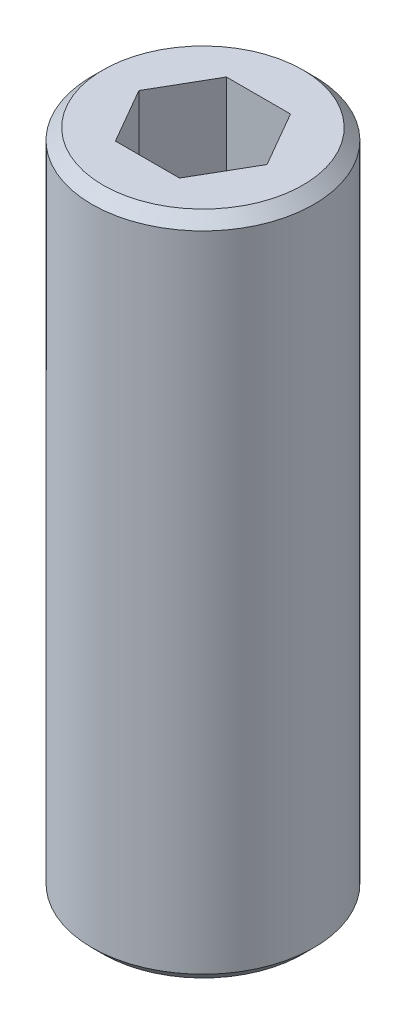
ISO-10303-21;
HEADER;
FILE_DESCRIPTION(('STEP AP214'),'2;1');
FILE_NAME('part.step','',(''),(''),'','','');
FILE_SCHEMA(('AUTOMOTIVE_DESIGN { 1 0 10303 214 1 1 1 1 }'));
ENDSEC;
DATA;
#1=APPLICATION_CONTEXT('core data for automotive mechanical design processes');
#2=APPLICATION_PROTOCOL_DEFINITION('international standard','automotive_design',2000,#1);
#3=PRODUCT_CONTEXT('',#1,'mechanical');
#4=PRODUCT('Part','Part','',(#3));
#5=PRODUCT_RELATED_PRODUCT_CATEGORY('part','',(#4));
#6=PRODUCT_DEFINITION_FORMATION('','',#4);
#7=PRODUCT_DEFINITION_CONTEXT('part definition',#1,'design');
#8=PRODUCT_DEFINITION('design','',#6,#7);
#9=PRODUCT_DEFINITION_SHAPE('','',#8);
#10=(LENGTH_UNIT() NAMED_UNIT(*) SI_UNIT(.MILLI.,.METRE.));
#11=(NAMED_UNIT(*) PLANE_ANGLE_UNIT() SI_UNIT($,.RADIAN.));
#12=(NAMED_UNIT(*) SI_UNIT($,.STERADIAN.) SOLID_ANGLE_UNIT());
#13=UNCERTAINTY_MEASURE_WITH_UNIT(LENGTH_MEASURE(1.E-05),#10,'distance_accuracy_value','');
#14=(GEOMETRIC_REPRESENTATION_CONTEXT(3) GLOBAL_UNCERTAINTY_ASSIGNED_CONTEXT((#13)) GLOBAL_UNIT_ASSIGNED_CONTEXT((#10,
#11,#12)) REPRESENTATION_CONTEXT('',''));
#15=CARTESIAN_POINT('',(0.,0.,0.));
#16=DIRECTION('',(0.,0.,1.));
#17=DIRECTION('',(1.,0.,0.));
#18=AXIS2_PLACEMENT_3D('',#15,#16,#17);
#19=CARTESIAN_POINT('',(0.,12.,0.));
#20=DIRECTION('',(0.,-1.,0.));
#21=DIRECTION('',(0.,0.,-1.));
#22=AXIS2_PLACEMENT_3D('',#19,#20,#21);
#23=CYLINDRICAL_SURFACE('',#22,2.);
#24=CARTESIAN_POINT('',(0.,0.199999999999995,0.));
#25=DIRECTION('',(0.,1.,0.));
#26=DIRECTION('',(0.,0.,1.));
#27=AXIS2_PLACEMENT_3D('',#24,#25,#26);
#28=CIRCLE('',#27,2.);
#29=CARTESIAN_POINT('',(0.,0.199999999999995,2.));
#30=VERTEX_POINT('',#29);
#31=EDGE_CURVE('E147',#30,#30,#28,.T.);
#32=ORIENTED_EDGE('',*,*,#31,.T.);
#33=EDGE_LOOP('',(#32));
#34=FACE_BOUND('',#33,.T.);
#35=CARTESIAN_POINT('',(0.,11.8,0.));
#36=DIRECTION('',(0.,1.,0.));
#37=DIRECTION('',(0.,0.,1.));
#38=AXIS2_PLACEMENT_3D('',#35,#36,#37);
#39=CIRCLE('',#38,2.);
#40=CARTESIAN_POINT('',(0.,11.8,2.));
#41=VERTEX_POINT('',#40);
#42=EDGE_CURVE('E139',#41,#41,#39,.F.);
#43=ORIENTED_EDGE('',*,*,#42,.T.);
#44=EDGE_LOOP('',(#43));
#45=FACE_BOUND('',#44,.T.);
#46=ADVANCED_FACE('F37',(#34,#45),#23,.T.);
#47=CARTESIAN_POINT('',(0.,12.,0.));
#48=DIRECTION('',(0.,1.,0.));
#49=DIRECTION('',(0.,0.,1.));
#50=AXIS2_PLACEMENT_3D('',#47,#48,#49);
#51=PLANE('',#50);
#52=DIRECTION('',(-0.499999999999999,0.,0.866025403784439));
#53=VECTOR('',#52,1.);
#54=CARTESIAN_POINT('',(-0.577350269189626,12.,-1.));
#55=LINE('',#54,#53);
#56=CARTESIAN_POINT('',(-0.577350269189626,12.,-1.));
#57=VERTEX_POINT('',#56);
#58=CARTESIAN_POINT('',(-1.15470053837925,12.,0.));
#59=VERTEX_POINT('',#58);
#60=EDGE_CURVE('E52',#57,#59,#55,.T.);
#61=ORIENTED_EDGE('',*,*,#60,.F.);
#62=DIRECTION('',(-1.,0.,0.));
#63=VECTOR('',#62,1.);
#64=CARTESIAN_POINT('',(0.577350269189625,12.,-1.));
#65=LINE('',#64,#63);
#66=CARTESIAN_POINT('',(0.577350269189625,12.,-1.));
#67=VERTEX_POINT('',#66);
#68=EDGE_CURVE('E135',#67,#57,#65,.T.);
#69=ORIENTED_EDGE('',*,*,#68,.F.);
#70=DIRECTION('',(-0.5,0.,-0.866025403784438));
#71=VECTOR('',#70,1.);
#72=CARTESIAN_POINT('',(1.15470053837925,12.,0.));
#73=LINE('',#72,#71);
#74=CARTESIAN_POINT('',(1.15470053837925,12.,0.));
#75=VERTEX_POINT('',#74);
#76=EDGE_CURVE('E133',#75,#67,#73,.T.);
#77=ORIENTED_EDGE('',*,*,#76,.F.);
#78=DIRECTION('',(0.5,0.,-0.866025403784439));
#79=VECTOR('',#78,1.);
#80=CARTESIAN_POINT('',(0.577350269189626,12.,1.));
#81=LINE('',#80,#79);
#82=CARTESIAN_POINT('',(0.577350269189626,12.,1.));
#83=VERTEX_POINT('',#82);
#84=EDGE_CURVE('E100',#83,#75,#81,.T.);
#85=ORIENTED_EDGE('',*,*,#84,.F.);
#86=DIRECTION('',(1.,0.,0.));
#87=VECTOR('',#86,1.);
#88=CARTESIAN_POINT('',(-0.577350269189626,12.,1.));
#89=LINE('',#88,#87);
#90=CARTESIAN_POINT('',(-0.577350269189626,12.,1.));
#91=VERTEX_POINT('',#90);
#92=EDGE_CURVE('E129',#91,#83,#89,.T.);
#93=ORIENTED_EDGE('',*,*,#92,.F.);
#94=DIRECTION('',(0.5,0.,0.866025403784439));
#95=VECTOR('',#94,1.);
#96=CARTESIAN_POINT('',(-1.15470053837925,12.,0.));
#97=LINE('',#96,#95);
#98=EDGE_CURVE('E126',#59,#91,#97,.T.);
#99=ORIENTED_EDGE('',*,*,#98,.F.);
#100=EDGE_LOOP('',(#61,#69,#77,#85,#93,#99));
#101=FACE_BOUND('',#100,.T.);
#102=CARTESIAN_POINT('',(0.,12.,0.));
#103=DIRECTION('',(0.,1.,0.));
#104=DIRECTION('',(0.,0.,1.));
#105=AXIS2_PLACEMENT_3D('',#102,#103,#104);
#106=CIRCLE('',#105,1.8);
#107=CARTESIAN_POINT('',(0.,12.,1.8));
#108=VERTEX_POINT('',#107);
#109=EDGE_CURVE('E11',#108,#108,#106,.T.);
#110=ORIENTED_EDGE('',*,*,#109,.T.);
#111=EDGE_LOOP('',(#110));
#112=FACE_BOUND('',#111,.T.);
#113=ADVANCED_FACE('F161',(#101,#112),#51,.T.);
#114=CARTESIAN_POINT('',(0.,0.,0.));
#115=DIRECTION('',(0.,1.,0.));
#116=DIRECTION('',(0.,0.,1.));
#117=AXIS2_PLACEMENT_3D('',#114,#115,#116);
#118=PLANE('',#117);
#119=CARTESIAN_POINT('',(0.,0.,0.));
#120=DIRECTION('',(0.,1.,0.));
#121=DIRECTION('',(0.,0.,1.));
#122=AXIS2_PLACEMENT_3D('',#119,#120,#121);
#123=CIRCLE('',#122,1.8);
#124=CARTESIAN_POINT('',(0.,0.,1.8));
#125=VERTEX_POINT('',#124);
#126=EDGE_CURVE('E45',#125,#125,#123,.F.);
#127=ORIENTED_EDGE('',*,*,#126,.T.);
#128=EDGE_LOOP('',(#127));
#129=FACE_BOUND('',#128,.T.);
#130=ADVANCED_FACE('F152',(#129),#118,.F.);
#131=CARTESIAN_POINT('',(0.,0.199999999999995,0.));
#132=DIRECTION('',(0.,1.,0.));
#133=DIRECTION('',(0.,0.,1.));
#134=AXIS2_PLACEMENT_3D('',#131,#132,#133);
#135=CONICAL_SURFACE('',#134,2.,0.785398163397453);
#136=ORIENTED_EDGE('',*,*,#126,.F.);
#137=EDGE_LOOP('',(#136));
#138=FACE_BOUND('',#137,.T.);
#139=ORIENTED_EDGE('',*,*,#31,.F.);
#140=EDGE_LOOP('',(#139));
#141=FACE_BOUND('',#140,.T.);
#142=ADVANCED_FACE('F154',(#138,#141),#135,.T.);
#143=CARTESIAN_POINT('',(0.,12.,0.));
#144=DIRECTION('',(0.,-1.,0.));
#145=DIRECTION('',(0.,0.,-1.));
#146=AXIS2_PLACEMENT_3D('',#143,#144,#145);
#147=CONICAL_SURFACE('',#146,1.8,0.785398163397444);
#148=ORIENTED_EDGE('',*,*,#42,.F.);
#149=EDGE_LOOP('',(#148));
#150=FACE_BOUND('',#149,.T.);
#151=ORIENTED_EDGE('',*,*,#109,.F.);
#152=EDGE_LOOP('',(#151));
#153=FACE_BOUND('',#152,.T.);
#154=ADVANCED_FACE('F39',(#150,#153),#147,.T.);
#155=CARTESIAN_POINT('',(-0.577350269189626,7.,-1.));
#156=DIRECTION('',(-0.866025403784439,0.,-0.5));
#157=DIRECTION('',(-0.5,0.,0.866025403784439));
#158=AXIS2_PLACEMENT_3D('',#155,#156,#157);
#159=PLANE('',#158);
#160=ORIENTED_EDGE('',*,*,#60,.T.);
#161=DIRECTION('',(0.,1.,0.));
#162=VECTOR('',#161,1.);
#163=CARTESIAN_POINT('',(-1.15470053837925,7.,0.));
#164=LINE('',#163,#162);
#165=CARTESIAN_POINT('',(-1.15470053837925,7.,0.));
#166=VERTEX_POINT('',#165);
#167=EDGE_CURVE('E82',#166,#59,#164,.T.);
#168=ORIENTED_EDGE('',*,*,#167,.F.);
#169=DIRECTION('',(-0.499999999999999,0.,0.866025403784439));
#170=VECTOR('',#169,1.);
#171=CARTESIAN_POINT('',(-0.577350269189626,7.,-1.));
#172=LINE('',#171,#170);
#173=CARTESIAN_POINT('',(-0.577350269189626,7.,-1.));
#174=VERTEX_POINT('',#173);
#175=EDGE_CURVE('E137',#174,#166,#172,.T.);
#176=ORIENTED_EDGE('',*,*,#175,.F.);
#177=DIRECTION('',(0.,1.,0.));
#178=VECTOR('',#177,1.);
#179=CARTESIAN_POINT('',(-0.577350269189626,7.,-1.));
#180=LINE('',#179,#178);
#181=EDGE_CURVE('E60',#174,#57,#180,.T.);
#182=ORIENTED_EDGE('',*,*,#181,.T.);
#183=EDGE_LOOP('',(#160,#168,#176,#182));
#184=FACE_BOUND('',#183,.T.);
#185=ADVANCED_FACE('F167',(#184),#159,.F.);
#186=CARTESIAN_POINT('',(0.577350269189625,7.,-1.));
#187=DIRECTION('',(0.,0.,-1.));
#188=DIRECTION('',(-1.,0.,0.));
#189=AXIS2_PLACEMENT_3D('',#186,#187,#188);
#190=PLANE('',#189);
#191=ORIENTED_EDGE('',*,*,#68,.T.);
#192=ORIENTED_EDGE('',*,*,#181,.F.);
#193=DIRECTION('',(-1.,0.,0.));
#194=VECTOR('',#193,1.);
#195=CARTESIAN_POINT('',(0.577350269189625,7.,-1.));
#196=LINE('',#195,#194);
#197=CARTESIAN_POINT('',(0.577350269189625,7.,-1.));
#198=VERTEX_POINT('',#197);
#199=EDGE_CURVE('E112',#198,#174,#196,.T.);
#200=ORIENTED_EDGE('',*,*,#199,.F.);
#201=DIRECTION('',(0.,1.,0.));
#202=VECTOR('',#201,1.);
#203=CARTESIAN_POINT('',(0.577350269189625,7.,-1.));
#204=LINE('',#203,#202);
#205=EDGE_CURVE('E104',#198,#67,#204,.T.);
#206=ORIENTED_EDGE('',*,*,#205,.T.);
#207=EDGE_LOOP('',(#191,#192,#200,#206));
#208=FACE_BOUND('',#207,.T.);
#209=ADVANCED_FACE('F180',(#208),#190,.F.);
#210=CARTESIAN_POINT('',(1.15470053837925,7.,0.));
#211=DIRECTION('',(0.866025403784438,0.,-0.5));
#212=DIRECTION('',(-0.5,0.,-0.866025403784439));
#213=AXIS2_PLACEMENT_3D('',#210,#211,#212);
#214=PLANE('',#213);
#215=ORIENTED_EDGE('',*,*,#76,.T.);
#216=ORIENTED_EDGE('',*,*,#205,.F.);
#217=DIRECTION('',(-0.5,0.,-0.866025403784438));
#218=VECTOR('',#217,1.);
#219=CARTESIAN_POINT('',(1.15470053837925,7.,0.));
#220=LINE('',#219,#218);
#221=CARTESIAN_POINT('',(1.15470053837925,7.,0.));
#222=VERTEX_POINT('',#221);
#223=EDGE_CURVE('E108',#222,#198,#220,.T.);
#224=ORIENTED_EDGE('',*,*,#223,.F.);
#225=DIRECTION('',(0.,1.,0.));
#226=VECTOR('',#225,1.);
#227=CARTESIAN_POINT('',(1.15470053837925,7.,0.));
#228=LINE('',#227,#226);
#229=EDGE_CURVE('E93',#222,#75,#228,.T.);
#230=ORIENTED_EDGE('',*,*,#229,.T.);
#231=EDGE_LOOP('',(#215,#216,#224,#230));
#232=FACE_BOUND('',#231,.T.);
#233=ADVANCED_FACE('F109',(#232),#214,.F.);
#234=CARTESIAN_POINT('',(0.577350269189626,7.,1.));
#235=DIRECTION('',(0.866025403784439,0.,0.5));
#236=DIRECTION('',(0.5,0.,-0.866025403784439));
#237=AXIS2_PLACEMENT_3D('',#234,#235,#236);
#238=PLANE('',#237);
#239=ORIENTED_EDGE('',*,*,#84,.T.);
#240=ORIENTED_EDGE('',*,*,#229,.F.);
#241=DIRECTION('',(0.5,0.,-0.866025403784439));
#242=VECTOR('',#241,1.);
#243=CARTESIAN_POINT('',(0.577350269189626,7.,1.));
#244=LINE('',#243,#242);
#245=CARTESIAN_POINT('',(0.577350269189626,7.,1.));
#246=VERTEX_POINT('',#245);
#247=EDGE_CURVE('E97',#246,#222,#244,.T.);
#248=ORIENTED_EDGE('',*,*,#247,.F.);
#249=DIRECTION('',(0.,1.,0.));
#250=VECTOR('',#249,1.);
#251=CARTESIAN_POINT('',(0.577350269189626,7.,1.));
#252=LINE('',#251,#250);
#253=EDGE_CURVE('E105',#246,#83,#252,.T.);
#254=ORIENTED_EDGE('',*,*,#253,.T.);
#255=EDGE_LOOP('',(#239,#240,#248,#254));
#256=FACE_BOUND('',#255,.T.);
#257=ADVANCED_FACE('F95',(#256),#238,.F.);
#258=CARTESIAN_POINT('',(-0.577350269189626,7.,1.));
#259=DIRECTION('',(0.,0.,1.));
#260=DIRECTION('',(1.,0.,0.));
#261=AXIS2_PLACEMENT_3D('',#258,#259,#260);
#262=PLANE('',#261);
#263=ORIENTED_EDGE('',*,*,#92,.T.);
#264=ORIENTED_EDGE('',*,*,#253,.F.);
#265=DIRECTION('',(1.,0.,0.));
#266=VECTOR('',#265,1.);
#267=CARTESIAN_POINT('',(-0.577350269189626,7.,1.));
#268=LINE('',#267,#266);
#269=CARTESIAN_POINT('',(-0.577350269189626,7.,1.));
#270=VERTEX_POINT('',#269);
#271=EDGE_CURVE('E118',#270,#246,#268,.T.);
#272=ORIENTED_EDGE('',*,*,#271,.F.);
#273=DIRECTION('',(0.,1.,0.));
#274=VECTOR('',#273,1.);
#275=CARTESIAN_POINT('',(-0.577350269189626,7.,1.));
#276=LINE('',#275,#274);
#277=EDGE_CURVE('E142',#270,#91,#276,.T.);
#278=ORIENTED_EDGE('',*,*,#277,.T.);
#279=EDGE_LOOP('',(#263,#264,#272,#278));
#280=FACE_BOUND('',#279,.T.);
#281=ADVANCED_FACE('F184',(#280),#262,.F.);
#282=CARTESIAN_POINT('',(-1.15470053837925,7.,0.));
#283=DIRECTION('',(-0.866025403784439,0.,0.5));
#284=DIRECTION('',(0.5,0.,0.866025403784439));
#285=AXIS2_PLACEMENT_3D('',#282,#283,#284);
#286=PLANE('',#285);
#287=ORIENTED_EDGE('',*,*,#98,.T.);
#288=ORIENTED_EDGE('',*,*,#277,.F.);
#289=DIRECTION('',(0.5,0.,0.866025403784439));
#290=VECTOR('',#289,1.);
#291=CARTESIAN_POINT('',(-1.15470053837925,7.,0.));
#292=LINE('',#291,#290);
#293=EDGE_CURVE('E120',#166,#270,#292,.T.);
#294=ORIENTED_EDGE('',*,*,#293,.F.);
#295=ORIENTED_EDGE('',*,*,#167,.T.);
#296=EDGE_LOOP('',(#287,#288,#294,#295));
#297=FACE_BOUND('',#296,.T.);
#298=ADVANCED_FACE('F181',(#297),#286,.F.);
#299=CARTESIAN_POINT('',(0.,7.,0.));
#300=DIRECTION('',(0.,1.,0.));
#301=DIRECTION('',(0.,0.,1.));
#302=AXIS2_PLACEMENT_3D('',#299,#300,#301);
#303=PLANE('',#302);
#304=ORIENTED_EDGE('',*,*,#175,.T.);
#305=ORIENTED_EDGE('',*,*,#293,.T.);
#306=ORIENTED_EDGE('',*,*,#271,.T.);
#307=ORIENTED_EDGE('',*,*,#247,.T.);
#308=ORIENTED_EDGE('',*,*,#223,.T.);
#309=ORIENTED_EDGE('',*,*,#199,.T.);
#310=EDGE_LOOP('',(#304,#305,#306,#307,#308,#309));
#311=FACE_BOUND('',#310,.T.);
#312=ADVANCED_FACE('F115',(#311),#303,.T.);
#313=CLOSED_SHELL('',(#46,#113,#130,#142,#154,#185,#209,#233,#257,#281,#298,#312));
#314=MANIFOLD_SOLID_BREP('B2',#313);
#315=ADVANCED_BREP_SHAPE_REPRESENTATION('',(#18,#314),#14);
#316=SHAPE_DEFINITION_REPRESENTATION(#9,#315);
ENDSEC;
END-ISO-10303-21;
